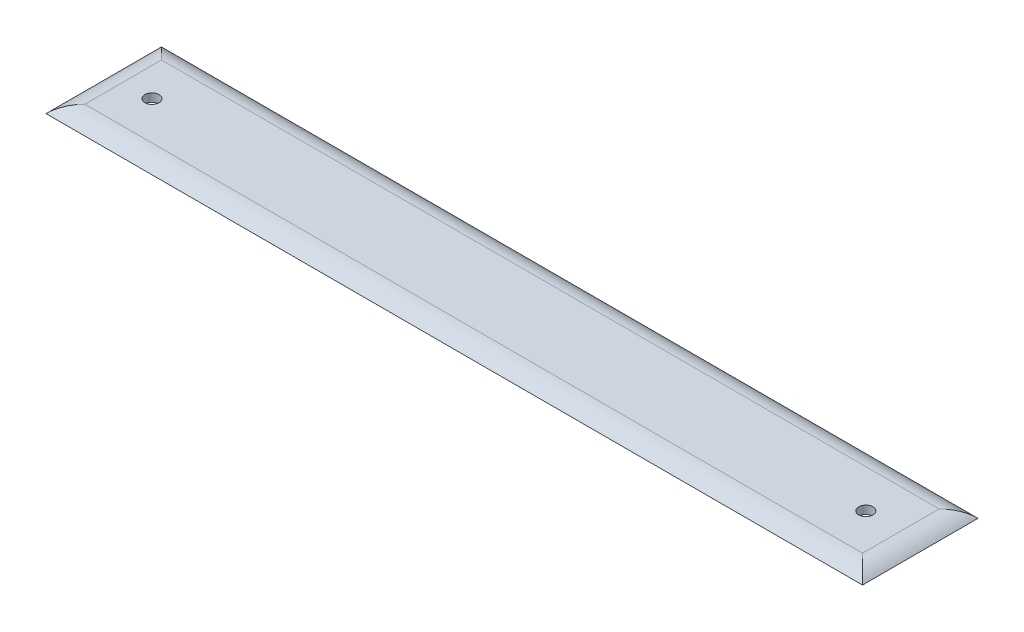
ISO-10303-21;
HEADER;
FILE_DESCRIPTION(('STEP AP214'),'2;1');
FILE_NAME('part.step','',(''),(''),'','','');
FILE_SCHEMA(('AUTOMOTIVE_DESIGN { 1 0 10303 214 1 1 1 1 }'));
ENDSEC;
DATA;
#1=APPLICATION_CONTEXT('core data for automotive mechanical design processes');
#2=APPLICATION_PROTOCOL_DEFINITION('international standard','automotive_design',2000,#1);
#3=PRODUCT_CONTEXT('',#1,'mechanical');
#4=PRODUCT('Part','Part','',(#3));
#5=PRODUCT_RELATED_PRODUCT_CATEGORY('part','',(#4));
#6=PRODUCT_DEFINITION_FORMATION('','',#4);
#7=PRODUCT_DEFINITION_CONTEXT('part definition',#1,'design');
#8=PRODUCT_DEFINITION('design','',#6,#7);
#9=PRODUCT_DEFINITION_SHAPE('','',#8);
#10=(LENGTH_UNIT() NAMED_UNIT(*) SI_UNIT(.MILLI.,.METRE.));
#11=(NAMED_UNIT(*) PLANE_ANGLE_UNIT() SI_UNIT($,.RADIAN.));
#12=(NAMED_UNIT(*) SI_UNIT($,.STERADIAN.) SOLID_ANGLE_UNIT());
#13=UNCERTAINTY_MEASURE_WITH_UNIT(LENGTH_MEASURE(1.E-05),#10,'distance_accuracy_value','');
#14=(GEOMETRIC_REPRESENTATION_CONTEXT(3) GLOBAL_UNCERTAINTY_ASSIGNED_CONTEXT((#13)) GLOBAL_UNIT_ASSIGNED_CONTEXT((#10,
#11,#12)) REPRESENTATION_CONTEXT('',''));
#15=CARTESIAN_POINT('',(0.,0.,0.));
#16=DIRECTION('',(0.,0.,1.));
#17=DIRECTION('',(1.,0.,0.));
#18=AXIS2_PLACEMENT_3D('',#15,#16,#17);
#19=CARTESIAN_POINT('',(-132.3,3.,0.));
#20=DIRECTION('',(0.,-1.,0.));
#21=DIRECTION('',(0.,0.,-1.));
#22=AXIS2_PLACEMENT_3D('',#19,#20,#21);
#23=CYLINDRICAL_SURFACE('',#22,2.59999999999999);
#24=CARTESIAN_POINT('',(-132.3,3.,0.));
#25=DIRECTION('',(0.,1.,0.));
#26=DIRECTION('',(0.,0.,1.));
#27=AXIS2_PLACEMENT_3D('',#24,#25,#26);
#28=CIRCLE('',#27,2.59999999999999);
#29=CARTESIAN_POINT('',(-132.3,3.,2.59999999999999));
#30=VERTEX_POINT('',#29);
#31=EDGE_CURVE('E124',#30,#30,#28,.T.);
#32=ORIENTED_EDGE('',*,*,#31,.T.);
#33=EDGE_LOOP('',(#32));
#34=FACE_BOUND('',#33,.T.);
#35=CARTESIAN_POINT('',(-132.3,0.,0.));
#36=DIRECTION('',(0.,1.,0.));
#37=DIRECTION('',(0.,0.,1.));
#38=AXIS2_PLACEMENT_3D('',#35,#36,#37);
#39=CIRCLE('',#38,2.59999999999999);
#40=CARTESIAN_POINT('',(-132.3,0.,2.59999999999999));
#41=VERTEX_POINT('',#40);
#42=EDGE_CURVE('E104',#41,#41,#39,.T.);
#43=ORIENTED_EDGE('',*,*,#42,.F.);
#44=EDGE_LOOP('',(#43));
#45=FACE_BOUND('',#44,.T.);
#46=ADVANCED_FACE('F45',(#34,#45),#23,.F.);
#47=CARTESIAN_POINT('',(130.,3.,0.));
#48=DIRECTION('',(0.,-1.,0.));
#49=DIRECTION('',(0.,0.,-1.));
#50=AXIS2_PLACEMENT_3D('',#47,#48,#49);
#51=CYLINDRICAL_SURFACE('',#50,2.59999999999999);
#52=CARTESIAN_POINT('',(130.,3.,0.));
#53=DIRECTION('',(0.,1.,0.));
#54=DIRECTION('',(0.,0.,1.));
#55=AXIS2_PLACEMENT_3D('',#52,#53,#54);
#56=CIRCLE('',#55,2.59999999999999);
#57=CARTESIAN_POINT('',(130.,3.,2.59999999999999));
#58=VERTEX_POINT('',#57);
#59=EDGE_CURVE('E128',#58,#58,#56,.T.);
#60=ORIENTED_EDGE('',*,*,#59,.T.);
#61=EDGE_LOOP('',(#60));
#62=FACE_BOUND('',#61,.T.);
#63=CARTESIAN_POINT('',(130.,0.,0.));
#64=DIRECTION('',(0.,1.,0.));
#65=DIRECTION('',(0.,0.,1.));
#66=AXIS2_PLACEMENT_3D('',#63,#64,#65);
#67=CIRCLE('',#66,2.59999999999999);
#68=CARTESIAN_POINT('',(130.,0.,2.59999999999999));
#69=VERTEX_POINT('',#68);
#70=EDGE_CURVE('E111',#69,#69,#67,.T.);
#71=ORIENTED_EDGE('',*,*,#70,.F.);
#72=EDGE_LOOP('',(#71));
#73=FACE_BOUND('',#72,.T.);
#74=ADVANCED_FACE('F144',(#62,#73),#51,.F.);
#75=CARTESIAN_POINT('',(0.,3.,0.));
#76=DIRECTION('',(0.,1.,0.));
#77=DIRECTION('',(0.,0.,1.));
#78=AXIS2_PLACEMENT_3D('',#75,#76,#77);
#79=PLANE('',#78);
#80=DIRECTION('',(-1.,0.,0.));
#81=VECTOR('',#80,1.);
#82=CARTESIAN_POINT('',(150.,3.,14.0735715714572));
#83=LINE('',#82,#81);
#84=CARTESIAN_POINT('',(-142.858571571457,3.,14.0735715714572));
#85=VERTEX_POINT('',#84);
#86=CARTESIAN_POINT('',(142.858571571457,3.,14.0735715714572));
#87=VERTEX_POINT('',#86);
#88=EDGE_CURVE('E55',#85,#87,#83,.F.);
#89=ORIENTED_EDGE('',*,*,#88,.T.);
#90=DIRECTION('',(0.,0.,-1.));
#91=VECTOR('',#90,1.);
#92=CARTESIAN_POINT('',(142.858571571457,3.,-21.215));
#93=LINE('',#92,#91);
#94=CARTESIAN_POINT('',(142.858571571457,3.,-14.0735715714572));
#95=VERTEX_POINT('',#94);
#96=EDGE_CURVE('E11',#87,#95,#93,.T.);
#97=ORIENTED_EDGE('',*,*,#96,.T.);
#98=DIRECTION('',(-1.,0.,0.));
#99=VECTOR('',#98,1.);
#100=CARTESIAN_POINT('',(-150.,3.,-14.0735715714572));
#101=LINE('',#100,#99);
#102=CARTESIAN_POINT('',(-142.858571571457,3.,-14.0735715714572));
#103=VERTEX_POINT('',#102);
#104=EDGE_CURVE('E121',#95,#103,#101,.T.);
#105=ORIENTED_EDGE('',*,*,#104,.T.);
#106=DIRECTION('',(0.,0.,-1.));
#107=VECTOR('',#106,1.);
#108=CARTESIAN_POINT('',(-142.858571571457,3.,21.215));
#109=LINE('',#108,#107);
#110=EDGE_CURVE('E66',#103,#85,#109,.F.);
#111=ORIENTED_EDGE('',*,*,#110,.T.);
#112=EDGE_LOOP('',(#89,#97,#105,#111));
#113=FACE_BOUND('',#112,.T.);
#114=ORIENTED_EDGE('',*,*,#59,.F.);
#115=EDGE_LOOP('',(#114));
#116=FACE_BOUND('',#115,.T.);
#117=ORIENTED_EDGE('',*,*,#31,.F.);
#118=EDGE_LOOP('',(#117));
#119=FACE_BOUND('',#118,.T.);
#120=ADVANCED_FACE('F147',(#113,#116,#119),#79,.T.);
#121=CARTESIAN_POINT('',(0.,0.,0.));
#122=DIRECTION('',(0.,1.,0.));
#123=DIRECTION('',(0.,0.,1.));
#124=AXIS2_PLACEMENT_3D('',#121,#122,#123);
#125=PLANE('',#124);
#126=ORIENTED_EDGE('',*,*,#70,.T.);
#127=EDGE_LOOP('',(#126));
#128=FACE_BOUND('',#127,.T.);
#129=ORIENTED_EDGE('',*,*,#42,.T.);
#130=EDGE_LOOP('',(#129));
#131=FACE_BOUND('',#130,.T.);
#132=DIRECTION('',(0.,0.,1.));
#133=VECTOR('',#132,1.);
#134=CARTESIAN_POINT('',(-150.,0.,0.));
#135=LINE('',#134,#133);
#136=CARTESIAN_POINT('',(-150.,0.,-21.215));
#137=VERTEX_POINT('',#136);
#138=CARTESIAN_POINT('',(-150.,0.,21.215));
#139=VERTEX_POINT('',#138);
#140=EDGE_CURVE('E90',#137,#139,#135,.T.);
#141=ORIENTED_EDGE('',*,*,#140,.F.);
#142=DIRECTION('',(1.,0.,0.));
#143=VECTOR('',#142,1.);
#144=CARTESIAN_POINT('',(0.,0.,-21.215));
#145=LINE('',#144,#143);
#146=CARTESIAN_POINT('',(150.,0.,-21.215));
#147=VERTEX_POINT('',#146);
#148=EDGE_CURVE('E125',#137,#147,#145,.T.);
#149=ORIENTED_EDGE('',*,*,#148,.T.);
#150=DIRECTION('',(0.,0.,1.));
#151=VECTOR('',#150,1.);
#152=CARTESIAN_POINT('',(150.,0.,0.));
#153=LINE('',#152,#151);
#154=CARTESIAN_POINT('',(150.,0.,21.215));
#155=VERTEX_POINT('',#154);
#156=EDGE_CURVE('E93',#147,#155,#153,.T.);
#157=ORIENTED_EDGE('',*,*,#156,.T.);
#158=DIRECTION('',(1.,0.,0.));
#159=VECTOR('',#158,1.);
#160=CARTESIAN_POINT('',(0.,0.,21.215));
#161=LINE('',#160,#159);
#162=EDGE_CURVE('E87',#139,#155,#161,.T.);
#163=ORIENTED_EDGE('',*,*,#162,.F.);
#164=EDGE_LOOP('',(#141,#149,#157,#163));
#165=FACE_BOUND('',#164,.T.);
#166=ADVANCED_FACE('F89',(#128,#131,#165),#125,.F.);
#167=CARTESIAN_POINT('',(-142.858571571457,-7.,0.));
#168=DIRECTION('',(0.,0.,1.));
#169=DIRECTION('',(1.,0.,0.));
#170=AXIS2_PLACEMENT_3D('',#167,#168,#169);
#171=CYLINDRICAL_SURFACE('',#170,10.);
#172=CARTESIAN_POINT('',(-142.858571571457,-7.,14.0735715714572));
#173=DIRECTION('',(0.707106781186547,0.,0.707106781186547));
#174=DIRECTION('',(-0.707106781186547,0.,0.707106781186547));
#175=AXIS2_PLACEMENT_3D('',#172,#173,#174);
#176=ELLIPSE('',#175,14.1421356237309,10.);
#177=EDGE_CURVE('E100',#85,#139,#176,.T.);
#178=ORIENTED_EDGE('',*,*,#177,.F.);
#179=ORIENTED_EDGE('',*,*,#110,.F.);
#180=CARTESIAN_POINT('',(-142.858571571457,-7.,-14.0735715714572));
#181=DIRECTION('',(0.707106781186547,0.,-0.707106781186547));
#182=DIRECTION('',(0.707106781186547,0.,0.707106781186547));
#183=AXIS2_PLACEMENT_3D('',#180,#181,#182);
#184=ELLIPSE('',#183,14.1421356237309,10.);
#185=EDGE_CURVE('E49',#137,#103,#184,.T.);
#186=ORIENTED_EDGE('',*,*,#185,.F.);
#187=ORIENTED_EDGE('',*,*,#140,.T.);
#188=EDGE_LOOP('',(#178,#179,#186,#187));
#189=FACE_BOUND('',#188,.T.);
#190=ADVANCED_FACE('F47',(#189),#171,.T.);
#191=CARTESIAN_POINT('',(0.,-7.,-14.0735715714572));
#192=DIRECTION('',(1.,0.,0.));
#193=DIRECTION('',(0.,0.,-1.));
#194=AXIS2_PLACEMENT_3D('',#191,#192,#193);
#195=CYLINDRICAL_SURFACE('',#194,10.);
#196=ORIENTED_EDGE('',*,*,#185,.T.);
#197=ORIENTED_EDGE('',*,*,#104,.F.);
#198=CARTESIAN_POINT('',(142.858571571457,-7.,-14.0735715714572));
#199=DIRECTION('',(0.707106781186547,0.,0.707106781186547));
#200=DIRECTION('',(0.707106781186547,0.,-0.707106781186547));
#201=AXIS2_PLACEMENT_3D('',#198,#199,#200);
#202=ELLIPSE('',#201,14.1421356237309,10.);
#203=EDGE_CURVE('E108',#147,#95,#202,.T.);
#204=ORIENTED_EDGE('',*,*,#203,.F.);
#205=ORIENTED_EDGE('',*,*,#148,.F.);
#206=EDGE_LOOP('',(#196,#197,#204,#205));
#207=FACE_BOUND('',#206,.T.);
#208=ADVANCED_FACE('F164',(#207),#195,.T.);
#209=CARTESIAN_POINT('',(0.,-7.,14.0735715714572));
#210=DIRECTION('',(1.,0.,0.));
#211=DIRECTION('',(0.,0.,-1.));
#212=AXIS2_PLACEMENT_3D('',#209,#210,#211);
#213=CYLINDRICAL_SURFACE('',#212,10.);
#214=ORIENTED_EDGE('',*,*,#177,.T.);
#215=ORIENTED_EDGE('',*,*,#162,.T.);
#216=CARTESIAN_POINT('',(142.858571571457,-7.,14.0735715714572));
#217=DIRECTION('',(0.707106781186547,0.,-0.707106781186547));
#218=DIRECTION('',(0.707106781186547,0.,0.707106781186547));
#219=AXIS2_PLACEMENT_3D('',#216,#217,#218);
#220=ELLIPSE('',#219,14.1421356237309,10.);
#221=EDGE_CURVE('E112',#87,#155,#220,.T.);
#222=ORIENTED_EDGE('',*,*,#221,.F.);
#223=ORIENTED_EDGE('',*,*,#88,.F.);
#224=EDGE_LOOP('',(#214,#215,#222,#223));
#225=FACE_BOUND('',#224,.T.);
#226=ADVANCED_FACE('F106',(#225),#213,.T.);
#227=CARTESIAN_POINT('',(142.858571571457,-7.,0.));
#228=DIRECTION('',(0.,0.,1.));
#229=DIRECTION('',(1.,0.,0.));
#230=AXIS2_PLACEMENT_3D('',#227,#228,#229);
#231=CYLINDRICAL_SURFACE('',#230,10.);
#232=ORIENTED_EDGE('',*,*,#203,.T.);
#233=ORIENTED_EDGE('',*,*,#96,.F.);
#234=ORIENTED_EDGE('',*,*,#221,.T.);
#235=ORIENTED_EDGE('',*,*,#156,.F.);
#236=EDGE_LOOP('',(#232,#233,#234,#235));
#237=FACE_BOUND('',#236,.T.);
#238=ADVANCED_FACE('F168',(#237),#231,.T.);
#239=CLOSED_SHELL('',(#46,#74,#120,#166,#190,#208,#226,#238));
#240=MANIFOLD_SOLID_BREP('B2',#239);
#241=ADVANCED_BREP_SHAPE_REPRESENTATION('',(#18,#240),#14);
#242=SHAPE_DEFINITION_REPRESENTATION(#9,#241);
ENDSEC;
END-ISO-10303-21;
